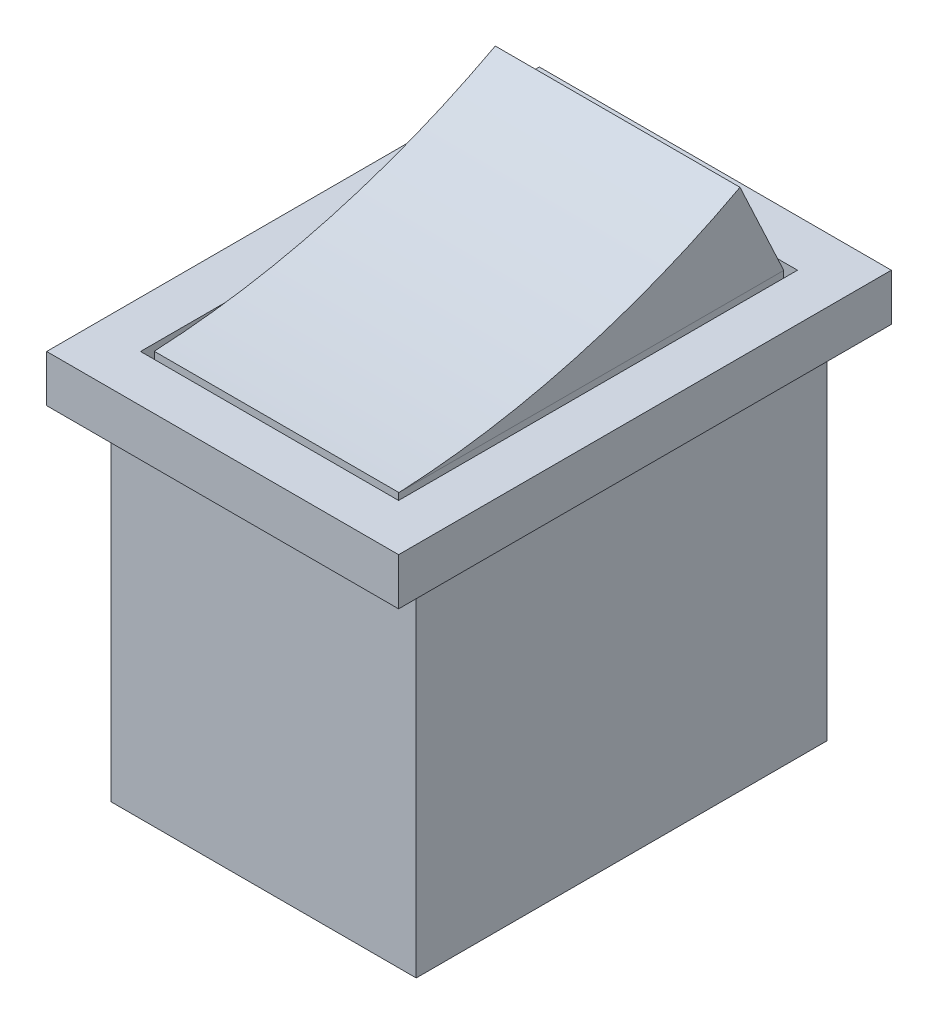
ISO-10303-21;
HEADER;
FILE_DESCRIPTION(('STEP AP214'),'2;1');
FILE_NAME('part.step','',(''),(''),'','','');
FILE_SCHEMA(('AUTOMOTIVE_DESIGN { 1 0 10303 214 1 1 1 1 }'));
ENDSEC;
DATA;
#1=APPLICATION_CONTEXT('core data for automotive mechanical design processes');
#2=APPLICATION_PROTOCOL_DEFINITION('international standard','automotive_design',2000,#1);
#3=PRODUCT_CONTEXT('',#1,'mechanical');
#4=PRODUCT('Part','Part','',(#3));
#5=PRODUCT_RELATED_PRODUCT_CATEGORY('part','',(#4));
#6=PRODUCT_DEFINITION_FORMATION('','',#4);
#7=PRODUCT_DEFINITION_CONTEXT('part definition',#1,'design');
#8=PRODUCT_DEFINITION('design','',#6,#7);
#9=PRODUCT_DEFINITION_SHAPE('','',#8);
#10=(LENGTH_UNIT() NAMED_UNIT(*) SI_UNIT(.MILLI.,.METRE.));
#11=(NAMED_UNIT(*) PLANE_ANGLE_UNIT() SI_UNIT($,.RADIAN.));
#12=(NAMED_UNIT(*) SI_UNIT($,.STERADIAN.) SOLID_ANGLE_UNIT());
#13=UNCERTAINTY_MEASURE_WITH_UNIT(LENGTH_MEASURE(1.E-05),#10,'distance_accuracy_value','');
#14=(GEOMETRIC_REPRESENTATION_CONTEXT(3) GLOBAL_UNCERTAINTY_ASSIGNED_CONTEXT((#13)) GLOBAL_UNIT_ASSIGNED_CONTEXT((#10,
#11,#12)) REPRESENTATION_CONTEXT('',''));
#15=CARTESIAN_POINT('',(0.,0.,0.));
#16=DIRECTION('',(0.,0.,1.));
#17=DIRECTION('',(1.,0.,0.));
#18=AXIS2_PLACEMENT_3D('',#15,#16,#17);
#19=CARTESIAN_POINT('',(5.215,17.,8.2));
#20=DIRECTION('',(0.,1.,0.));
#21=DIRECTION('',(0.,0.,1.));
#22=AXIS2_PLACEMENT_3D('',#19,#20,#21);
#23=PLANE('',#22);
#24=DIRECTION('',(0.,0.,-1.));
#25=VECTOR('',#24,1.);
#26=CARTESIAN_POINT('',(-5.215,17.,8.2));
#27=LINE('',#26,#25);
#28=CARTESIAN_POINT('',(-5.215,17.,8.2));
#29=VERTEX_POINT('',#28);
#30=CARTESIAN_POINT('',(-5.215,17.,-8.2));
#31=VERTEX_POINT('',#30);
#32=EDGE_CURVE('E93',#29,#31,#27,.T.);
#33=ORIENTED_EDGE('',*,*,#32,.T.);
#34=DIRECTION('',(-1.,0.,0.));
#35=VECTOR('',#34,1.);
#36=CARTESIAN_POINT('',(5.215,17.,-8.2));
#37=LINE('',#36,#35);
#38=CARTESIAN_POINT('',(5.215,17.,-8.2));
#39=VERTEX_POINT('',#38);
#40=EDGE_CURVE('E12',#39,#31,#37,.T.);
#41=ORIENTED_EDGE('',*,*,#40,.F.);
#42=DIRECTION('',(0.,0.,-1.));
#43=VECTOR('',#42,1.);
#44=CARTESIAN_POINT('',(5.215,17.,8.2));
#45=LINE('',#44,#43);
#46=CARTESIAN_POINT('',(5.215,17.,8.2));
#47=VERTEX_POINT('',#46);
#48=EDGE_CURVE('E86',#47,#39,#45,.T.);
#49=ORIENTED_EDGE('',*,*,#48,.F.);
#50=DIRECTION('',(-1.,0.,0.));
#51=VECTOR('',#50,1.);
#52=CARTESIAN_POINT('',(5.215,17.,8.2));
#53=LINE('',#52,#51);
#54=EDGE_CURVE('E94',#47,#29,#53,.T.);
#55=ORIENTED_EDGE('',*,*,#54,.T.);
#56=EDGE_LOOP('',(#33,#41,#49,#55));
#57=FACE_BOUND('',#56,.T.);
#58=ADVANCED_FACE('F46',(#57),#23,.F.);
#59=CARTESIAN_POINT('',(5.215,17.,-8.2));
#60=DIRECTION('',(0.,-0.422618261740704,0.906307787036648));
#61=DIRECTION('',(0.,-0.906307787036648,-0.422618261740704));
#62=AXIS2_PLACEMENT_3D('',#59,#60,#61);
#63=PLANE('',#62);
#64=DIRECTION('',(0.,0.906307787036648,0.422618261740704));
#65=VECTOR('',#64,1.);
#66=CARTESIAN_POINT('',(-5.215,17.,-8.2));
#67=LINE('',#66,#65);
#68=CARTESIAN_POINT('',(-5.215,21.,-6.33476936737998));
#69=VERTEX_POINT('',#68);
#70=EDGE_CURVE('E74',#31,#69,#67,.T.);
#71=ORIENTED_EDGE('',*,*,#70,.T.);
#72=DIRECTION('',(-1.,0.,0.));
#73=VECTOR('',#72,1.);
#74=CARTESIAN_POINT('',(5.215,21.,-6.33476936737998));
#75=LINE('',#74,#73);
#76=CARTESIAN_POINT('',(5.215,21.,-6.33476936737998));
#77=VERTEX_POINT('',#76);
#78=EDGE_CURVE('E54',#77,#69,#75,.T.);
#79=ORIENTED_EDGE('',*,*,#78,.F.);
#80=DIRECTION('',(0.,0.906307787036648,0.422618261740704));
#81=VECTOR('',#80,1.);
#82=CARTESIAN_POINT('',(5.215,17.,-8.2));
#83=LINE('',#82,#81);
#84=EDGE_CURVE('E82',#39,#77,#83,.T.);
#85=ORIENTED_EDGE('',*,*,#84,.F.);
#86=ORIENTED_EDGE('',*,*,#40,.T.);
#87=EDGE_LOOP('',(#71,#79,#85,#86));
#88=FACE_BOUND('',#87,.T.);
#89=ADVANCED_FACE('F83',(#88),#63,.F.);
#90=CARTESIAN_POINT('',(5.215,51.3836332347754,9.84466129825813));
#91=DIRECTION('',(-1.,0.,0.));
#92=DIRECTION('',(0.,0.,1.));
#93=AXIS2_PLACEMENT_3D('',#90,#91,#92);
#94=CYLINDRICAL_SURFACE('',#93,34.4229450397484);
#95=CARTESIAN_POINT('',(-5.215,51.3836332347754,9.84466129825813));
#96=DIRECTION('',(-1.,0.,0.));
#97=DIRECTION('',(0.,0.,1.));
#98=AXIS2_PLACEMENT_3D('',#95,#96,#97);
#99=CIRCLE('',#98,34.4229450397484);
#100=EDGE_CURVE('E79',#69,#29,#99,.T.);
#101=ORIENTED_EDGE('',*,*,#100,.T.);
#102=ORIENTED_EDGE('',*,*,#54,.F.);
#103=CARTESIAN_POINT('',(5.215,51.3836332347754,9.84466129825813));
#104=DIRECTION('',(-1.,0.,0.));
#105=DIRECTION('',(0.,0.,1.));
#106=AXIS2_PLACEMENT_3D('',#103,#104,#105);
#107=CIRCLE('',#106,34.4229450397484);
#108=EDGE_CURVE('E62',#77,#47,#107,.T.);
#109=ORIENTED_EDGE('',*,*,#108,.F.);
#110=ORIENTED_EDGE('',*,*,#78,.T.);
#111=EDGE_LOOP('',(#101,#102,#109,#110));
#112=FACE_BOUND('',#111,.T.);
#113=ADVANCED_FACE('F101',(#112),#94,.F.);
#114=CARTESIAN_POINT('',(5.215,51.3836332347754,9.84466129825813));
#115=DIRECTION('',(-1.,0.,0.));
#116=DIRECTION('',(0.,0.,1.));
#117=AXIS2_PLACEMENT_3D('',#114,#115,#116);
#118=PLANE('',#117);
#119=ORIENTED_EDGE('',*,*,#48,.T.);
#120=ORIENTED_EDGE('',*,*,#84,.T.);
#121=ORIENTED_EDGE('',*,*,#108,.T.);
#122=EDGE_LOOP('',(#119,#120,#121));
#123=FACE_BOUND('',#122,.T.);
#124=ADVANCED_FACE('F89',(#123),#118,.F.);
#125=CARTESIAN_POINT('',(-5.215,51.3836332347754,9.84466129825813));
#126=DIRECTION('',(-1.,0.,0.));
#127=DIRECTION('',(0.,0.,1.));
#128=AXIS2_PLACEMENT_3D('',#125,#126,#127);
#129=PLANE('',#128);
#130=ORIENTED_EDGE('',*,*,#32,.F.);
#131=ORIENTED_EDGE('',*,*,#100,.F.);
#132=ORIENTED_EDGE('',*,*,#70,.F.);
#133=EDGE_LOOP('',(#130,#131,#132));
#134=FACE_BOUND('',#133,.T.);
#135=ADVANCED_FACE('F102',(#134),#129,.T.);
#136=CLOSED_SHELL('',(#58,#89,#113,#124,#135));
#137=MANIFOLD_SOLID_BREP('B2',#136);
#138=CARTESIAN_POINT('',(6.5,15.,8.74999999999999));
#139=DIRECTION('',(-1.,0.,0.));
#140=DIRECTION('',(0.,0.,1.));
#141=AXIS2_PLACEMENT_3D('',#138,#139,#140);
#142=PLANE('',#141);
#143=DIRECTION('',(0.,0.,-1.));
#144=VECTOR('',#143,1.);
#145=CARTESIAN_POINT('',(6.5,0.,8.74999999999999));
#146=LINE('',#145,#144);
#147=CARTESIAN_POINT('',(6.5,0.,8.74999999999999));
#148=VERTEX_POINT('',#147);
#149=CARTESIAN_POINT('',(6.5,0.,-8.75000000000001));
#150=VERTEX_POINT('',#149);
#151=EDGE_CURVE('E366',#148,#150,#146,.T.);
#152=ORIENTED_EDGE('',*,*,#151,.T.);
#153=DIRECTION('',(0.,-1.,0.));
#154=VECTOR('',#153,1.);
#155=CARTESIAN_POINT('',(6.5,15.,-8.75000000000001));
#156=LINE('',#155,#154);
#157=CARTESIAN_POINT('',(6.5,15.,-8.75000000000001));
#158=VERTEX_POINT('',#157);
#159=EDGE_CURVE('E44',#158,#150,#156,.T.);
#160=ORIENTED_EDGE('',*,*,#159,.F.);
#161=DIRECTION('',(0.,0.,-1.));
#162=VECTOR('',#161,1.);
#163=CARTESIAN_POINT('',(6.5,15.,8.74999999999999));
#164=LINE('',#163,#162);
#165=CARTESIAN_POINT('',(6.5,15.,8.74999999999999));
#166=VERTEX_POINT('',#165);
#167=EDGE_CURVE('E367',#166,#158,#164,.T.);
#168=ORIENTED_EDGE('',*,*,#167,.F.);
#169=DIRECTION('',(0.,-1.,0.));
#170=VECTOR('',#169,1.);
#171=CARTESIAN_POINT('',(6.5,15.,8.74999999999999));
#172=LINE('',#171,#170);
#173=EDGE_CURVE('E380',#166,#148,#172,.T.);
#174=ORIENTED_EDGE('',*,*,#173,.T.);
#175=EDGE_LOOP('',(#152,#160,#168,#174));
#176=FACE_BOUND('',#175,.T.);
#177=ADVANCED_FACE('F153',(#176),#142,.F.);
#178=CARTESIAN_POINT('',(-6.5,15.,-8.75000000000001));
#179=DIRECTION('',(0.,0.,1.));
#180=DIRECTION('',(1.,0.,0.));
#181=AXIS2_PLACEMENT_3D('',#178,#179,#180);
#182=PLANE('',#181);
#183=DIRECTION('',(-1.,0.,0.));
#184=VECTOR('',#183,1.);
#185=CARTESIAN_POINT('',(-6.5,0.,-8.75000000000001));
#186=LINE('',#185,#184);
#187=CARTESIAN_POINT('',(-6.5,0.,-8.75000000000001));
#188=VERTEX_POINT('',#187);
#189=EDGE_CURVE('E383',#150,#188,#186,.T.);
#190=ORIENTED_EDGE('',*,*,#189,.T.);
#191=DIRECTION('',(0.,-1.,0.));
#192=VECTOR('',#191,1.);
#193=CARTESIAN_POINT('',(-6.5,15.,-8.75000000000001));
#194=LINE('',#193,#192);
#195=CARTESIAN_POINT('',(-6.5,15.,-8.75000000000001));
#196=VERTEX_POINT('',#195);
#197=EDGE_CURVE('E160',#196,#188,#194,.T.);
#198=ORIENTED_EDGE('',*,*,#197,.F.);
#199=DIRECTION('',(-1.,0.,0.));
#200=VECTOR('',#199,1.);
#201=CARTESIAN_POINT('',(-6.5,15.,-8.75000000000001));
#202=LINE('',#201,#200);
#203=EDGE_CURVE('E370',#158,#196,#202,.T.);
#204=ORIENTED_EDGE('',*,*,#203,.F.);
#205=ORIENTED_EDGE('',*,*,#159,.T.);
#206=EDGE_LOOP('',(#190,#198,#204,#205));
#207=FACE_BOUND('',#206,.T.);
#208=ADVANCED_FACE('F410',(#207),#182,.F.);
#209=CARTESIAN_POINT('',(-6.5,15.,8.74999999999999));
#210=DIRECTION('',(1.,0.,0.));
#211=DIRECTION('',(0.,0.,-1.));
#212=AXIS2_PLACEMENT_3D('',#209,#210,#211);
#213=PLANE('',#212);
#214=DIRECTION('',(0.,0.,1.));
#215=VECTOR('',#214,1.);
#216=CARTESIAN_POINT('',(-6.5,0.,8.74999999999999));
#217=LINE('',#216,#215);
#218=CARTESIAN_POINT('',(-6.5,0.,8.74999999999999));
#219=VERTEX_POINT('',#218);
#220=EDGE_CURVE('E385',#188,#219,#217,.T.);
#221=ORIENTED_EDGE('',*,*,#220,.T.);
#222=DIRECTION('',(0.,-1.,0.));
#223=VECTOR('',#222,1.);
#224=CARTESIAN_POINT('',(-6.5,15.,8.74999999999999));
#225=LINE('',#224,#223);
#226=CARTESIAN_POINT('',(-6.5,15.,8.74999999999999));
#227=VERTEX_POINT('',#226);
#228=EDGE_CURVE('E390',#227,#219,#225,.T.);
#229=ORIENTED_EDGE('',*,*,#228,.F.);
#230=DIRECTION('',(0.,0.,1.));
#231=VECTOR('',#230,1.);
#232=CARTESIAN_POINT('',(-6.5,15.,8.74999999999999));
#233=LINE('',#232,#231);
#234=EDGE_CURVE('E374',#196,#227,#233,.T.);
#235=ORIENTED_EDGE('',*,*,#234,.F.);
#236=ORIENTED_EDGE('',*,*,#197,.T.);
#237=EDGE_LOOP('',(#221,#229,#235,#236));
#238=FACE_BOUND('',#237,.T.);
#239=ADVANCED_FACE('F396',(#238),#213,.F.);
#240=CARTESIAN_POINT('',(-6.5,15.,8.74999999999999));
#241=DIRECTION('',(0.,0.,-1.));
#242=DIRECTION('',(-1.,0.,0.));
#243=AXIS2_PLACEMENT_3D('',#240,#241,#242);
#244=PLANE('',#243);
#245=DIRECTION('',(1.,0.,0.));
#246=VECTOR('',#245,1.);
#247=CARTESIAN_POINT('',(-6.5,0.,8.74999999999999));
#248=LINE('',#247,#246);
#249=EDGE_CURVE('E371',#219,#148,#248,.T.);
#250=ORIENTED_EDGE('',*,*,#249,.T.);
#251=ORIENTED_EDGE('',*,*,#173,.F.);
#252=DIRECTION('',(1.,0.,0.));
#253=VECTOR('',#252,1.);
#254=CARTESIAN_POINT('',(-6.5,15.,8.74999999999999));
#255=LINE('',#254,#253);
#256=EDGE_CURVE('E377',#227,#166,#255,.T.);
#257=ORIENTED_EDGE('',*,*,#256,.F.);
#258=ORIENTED_EDGE('',*,*,#228,.T.);
#259=EDGE_LOOP('',(#250,#251,#257,#258));
#260=FACE_BOUND('',#259,.T.);
#261=ADVANCED_FACE('F404',(#260),#244,.F.);
#262=CARTESIAN_POINT('',(0.,0.,0.));
#263=DIRECTION('',(0.,-1.,0.));
#264=DIRECTION('',(0.,0.,-1.));
#265=AXIS2_PLACEMENT_3D('',#262,#263,#264);
#266=PLANE('',#265);
#267=ORIENTED_EDGE('',*,*,#151,.F.);
#268=ORIENTED_EDGE('',*,*,#249,.F.);
#269=ORIENTED_EDGE('',*,*,#220,.F.);
#270=ORIENTED_EDGE('',*,*,#189,.F.);
#271=EDGE_LOOP('',(#267,#268,#269,#270));
#272=FACE_BOUND('',#271,.T.);
#273=ADVANCED_FACE('F401',(#272),#266,.T.);
#274=CARTESIAN_POINT('',(0.,15.,0.));
#275=DIRECTION('',(0.,-1.,0.));
#276=DIRECTION('',(0.,0.,-1.));
#277=AXIS2_PLACEMENT_3D('',#274,#275,#276);
#278=PLANE('',#277);
#279=DIRECTION('',(0.,0.,-1.));
#280=VECTOR('',#279,1.);
#281=CARTESIAN_POINT('',(7.5,15.,10.5));
#282=LINE('',#281,#280);
#283=CARTESIAN_POINT('',(7.5,15.,10.5));
#284=VERTEX_POINT('',#283);
#285=CARTESIAN_POINT('',(7.5,15.,-10.5));
#286=VERTEX_POINT('',#285);
#287=EDGE_CURVE('E331',#284,#286,#282,.T.);
#288=ORIENTED_EDGE('',*,*,#287,.F.);
#289=DIRECTION('',(1.,0.,0.));
#290=VECTOR('',#289,1.);
#291=CARTESIAN_POINT('',(-7.5,15.,10.5));
#292=LINE('',#291,#290);
#293=CARTESIAN_POINT('',(-7.5,15.,10.5));
#294=VERTEX_POINT('',#293);
#295=EDGE_CURVE('E341',#294,#284,#292,.T.);
#296=ORIENTED_EDGE('',*,*,#295,.F.);
#297=DIRECTION('',(0.,0.,1.));
#298=VECTOR('',#297,1.);
#299=CARTESIAN_POINT('',(-7.5,15.,10.5));
#300=LINE('',#299,#298);
#301=CARTESIAN_POINT('',(-7.5,15.,-10.5));
#302=VERTEX_POINT('',#301);
#303=EDGE_CURVE('E352',#302,#294,#300,.T.);
#304=ORIENTED_EDGE('',*,*,#303,.F.);
#305=DIRECTION('',(-1.,0.,0.));
#306=VECTOR('',#305,1.);
#307=CARTESIAN_POINT('',(-7.5,15.,-10.5));
#308=LINE('',#307,#306);
#309=EDGE_CURVE('E350',#286,#302,#308,.T.);
#310=ORIENTED_EDGE('',*,*,#309,.F.);
#311=EDGE_LOOP('',(#288,#296,#304,#310));
#312=FACE_BOUND('',#311,.T.);
#313=ORIENTED_EDGE('',*,*,#167,.T.);
#314=ORIENTED_EDGE('',*,*,#203,.T.);
#315=ORIENTED_EDGE('',*,*,#234,.T.);
#316=ORIENTED_EDGE('',*,*,#256,.T.);
#317=EDGE_LOOP('',(#313,#314,#315,#316));
#318=FACE_BOUND('',#317,.T.);
#319=ADVANCED_FACE('F409',(#312,#318),#278,.T.);
#320=CARTESIAN_POINT('',(7.5,17.,10.5));
#321=DIRECTION('',(-1.,0.,0.));
#322=DIRECTION('',(0.,0.,1.));
#323=AXIS2_PLACEMENT_3D('',#320,#321,#322);
#324=PLANE('',#323);
#325=ORIENTED_EDGE('',*,*,#287,.T.);
#326=DIRECTION('',(0.,-1.,0.));
#327=VECTOR('',#326,1.);
#328=CARTESIAN_POINT('',(7.5,17.,-10.5));
#329=LINE('',#328,#327);
#330=CARTESIAN_POINT('',(7.5,17.,-10.5));
#331=VERTEX_POINT('',#330);
#332=EDGE_CURVE('E363',#331,#286,#329,.T.);
#333=ORIENTED_EDGE('',*,*,#332,.F.);
#334=DIRECTION('',(0.,0.,-1.));
#335=VECTOR('',#334,1.);
#336=CARTESIAN_POINT('',(7.5,17.,10.5));
#337=LINE('',#336,#335);
#338=CARTESIAN_POINT('',(7.5,17.,10.5));
#339=VERTEX_POINT('',#338);
#340=EDGE_CURVE('E337',#339,#331,#337,.T.);
#341=ORIENTED_EDGE('',*,*,#340,.F.);
#342=DIRECTION('',(0.,-1.,0.));
#343=VECTOR('',#342,1.);
#344=CARTESIAN_POINT('',(7.5,17.,10.5));
#345=LINE('',#344,#343);
#346=EDGE_CURVE('E347',#339,#284,#345,.T.);
#347=ORIENTED_EDGE('',*,*,#346,.T.);
#348=EDGE_LOOP('',(#325,#333,#341,#347));
#349=FACE_BOUND('',#348,.T.);
#350=ADVANCED_FACE('F422',(#349),#324,.F.);
#351=CARTESIAN_POINT('',(-7.5,17.,-10.5));
#352=DIRECTION('',(0.,0.,1.));
#353=DIRECTION('',(1.,0.,0.));
#354=AXIS2_PLACEMENT_3D('',#351,#352,#353);
#355=PLANE('',#354);
#356=ORIENTED_EDGE('',*,*,#309,.T.);
#357=DIRECTION('',(0.,-1.,0.));
#358=VECTOR('',#357,1.);
#359=CARTESIAN_POINT('',(-7.5,17.,-10.5));
#360=LINE('',#359,#358);
#361=CARTESIAN_POINT('',(-7.5,17.,-10.5));
#362=VERTEX_POINT('',#361);
#363=EDGE_CURVE('E360',#362,#302,#360,.T.);
#364=ORIENTED_EDGE('',*,*,#363,.F.);
#365=DIRECTION('',(-1.,0.,0.));
#366=VECTOR('',#365,1.);
#367=CARTESIAN_POINT('',(-7.5,17.,-10.5));
#368=LINE('',#367,#366);
#369=EDGE_CURVE('E340',#331,#362,#368,.T.);
#370=ORIENTED_EDGE('',*,*,#369,.F.);
#371=ORIENTED_EDGE('',*,*,#332,.T.);
#372=EDGE_LOOP('',(#356,#364,#370,#371));
#373=FACE_BOUND('',#372,.T.);
#374=ADVANCED_FACE('F425',(#373),#355,.F.);
#375=CARTESIAN_POINT('',(-7.5,17.,10.5));
#376=DIRECTION('',(1.,0.,0.));
#377=DIRECTION('',(0.,0.,-1.));
#378=AXIS2_PLACEMENT_3D('',#375,#376,#377);
#379=PLANE('',#378);
#380=ORIENTED_EDGE('',*,*,#303,.T.);
#381=DIRECTION('',(0.,-1.,0.));
#382=VECTOR('',#381,1.);
#383=CARTESIAN_POINT('',(-7.5,17.,10.5));
#384=LINE('',#383,#382);
#385=CARTESIAN_POINT('',(-7.5,17.,10.5));
#386=VERTEX_POINT('',#385);
#387=EDGE_CURVE('E357',#386,#294,#384,.T.);
#388=ORIENTED_EDGE('',*,*,#387,.F.);
#389=DIRECTION('',(0.,0.,1.));
#390=VECTOR('',#389,1.);
#391=CARTESIAN_POINT('',(-7.5,17.,10.5));
#392=LINE('',#391,#390);
#393=EDGE_CURVE('E343',#362,#386,#392,.T.);
#394=ORIENTED_EDGE('',*,*,#393,.F.);
#395=ORIENTED_EDGE('',*,*,#363,.T.);
#396=EDGE_LOOP('',(#380,#388,#394,#395));
#397=FACE_BOUND('',#396,.T.);
#398=ADVANCED_FACE('F429',(#397),#379,.F.);
#399=CARTESIAN_POINT('',(-7.5,17.,10.5));
#400=DIRECTION('',(0.,0.,-1.));
#401=DIRECTION('',(-1.,0.,0.));
#402=AXIS2_PLACEMENT_3D('',#399,#400,#401);
#403=PLANE('',#402);
#404=ORIENTED_EDGE('',*,*,#295,.T.);
#405=ORIENTED_EDGE('',*,*,#346,.F.);
#406=DIRECTION('',(1.,0.,0.));
#407=VECTOR('',#406,1.);
#408=CARTESIAN_POINT('',(-7.5,17.,10.5));
#409=LINE('',#408,#407);
#410=EDGE_CURVE('E345',#386,#339,#409,.T.);
#411=ORIENTED_EDGE('',*,*,#410,.F.);
#412=ORIENTED_EDGE('',*,*,#387,.T.);
#413=EDGE_LOOP('',(#404,#405,#411,#412));
#414=FACE_BOUND('',#413,.T.);
#415=ADVANCED_FACE('F433',(#414),#403,.F.);
#416=CARTESIAN_POINT('',(0.,17.,0.));
#417=DIRECTION('',(0.,-1.,0.));
#418=DIRECTION('',(0.,0.,-1.));
#419=AXIS2_PLACEMENT_3D('',#416,#417,#418);
#420=PLANE('',#419);
#421=DIRECTION('',(-1.,0.,0.));
#422=VECTOR('',#421,1.);
#423=CARTESIAN_POINT('',(5.5,17.,-8.5));
#424=LINE('',#423,#422);
#425=CARTESIAN_POINT('',(5.5,17.,-8.5));
#426=VERTEX_POINT('',#425);
#427=CARTESIAN_POINT('',(-5.5,17.,-8.5));
#428=VERTEX_POINT('',#427);
#429=EDGE_CURVE('E321',#426,#428,#424,.T.);
#430=ORIENTED_EDGE('',*,*,#429,.F.);
#431=DIRECTION('',(0.,0.,-1.));
#432=VECTOR('',#431,1.);
#433=CARTESIAN_POINT('',(5.5,17.,8.5));
#434=LINE('',#433,#432);
#435=CARTESIAN_POINT('',(5.5,17.,8.5));
#436=VERTEX_POINT('',#435);
#437=EDGE_CURVE('E167',#436,#426,#434,.T.);
#438=ORIENTED_EDGE('',*,*,#437,.F.);
#439=DIRECTION('',(1.,0.,0.));
#440=VECTOR('',#439,1.);
#441=CARTESIAN_POINT('',(-5.5,17.,8.5));
#442=LINE('',#441,#440);
#443=CARTESIAN_POINT('',(-5.5,17.,8.5));
#444=VERTEX_POINT('',#443);
#445=EDGE_CURVE('E310',#444,#436,#442,.T.);
#446=ORIENTED_EDGE('',*,*,#445,.F.);
#447=DIRECTION('',(0.,0.,1.));
#448=VECTOR('',#447,1.);
#449=CARTESIAN_POINT('',(-5.5,17.,-8.5));
#450=LINE('',#449,#448);
#451=EDGE_CURVE('E324',#428,#444,#450,.T.);
#452=ORIENTED_EDGE('',*,*,#451,.F.);
#453=EDGE_LOOP('',(#430,#438,#446,#452));
#454=FACE_BOUND('',#453,.T.);
#455=ORIENTED_EDGE('',*,*,#340,.T.);
#456=ORIENTED_EDGE('',*,*,#369,.T.);
#457=ORIENTED_EDGE('',*,*,#393,.T.);
#458=ORIENTED_EDGE('',*,*,#410,.T.);
#459=EDGE_LOOP('',(#455,#456,#457,#458));
#460=FACE_BOUND('',#459,.T.);
#461=ADVANCED_FACE('F437',(#454,#460),#420,.F.);
#462=CARTESIAN_POINT('',(5.5,14.,8.5));
#463=DIRECTION('',(1.,0.,0.));
#464=DIRECTION('',(0.,0.,-1.));
#465=AXIS2_PLACEMENT_3D('',#462,#463,#464);
#466=PLANE('',#465);
#467=ORIENTED_EDGE('',*,*,#437,.T.);
#468=DIRECTION('',(0.,1.,0.));
#469=VECTOR('',#468,1.);
#470=CARTESIAN_POINT('',(5.5,14.,-8.5));
#471=LINE('',#470,#469);
#472=CARTESIAN_POINT('',(5.5,14.,-8.5));
#473=VERTEX_POINT('',#472);
#474=EDGE_CURVE('E319',#473,#426,#471,.T.);
#475=ORIENTED_EDGE('',*,*,#474,.F.);
#476=DIRECTION('',(0.,0.,-1.));
#477=VECTOR('',#476,1.);
#478=CARTESIAN_POINT('',(5.5,14.,8.5));
#479=LINE('',#478,#477);
#480=CARTESIAN_POINT('',(5.5,14.,8.5));
#481=VERTEX_POINT('',#480);
#482=EDGE_CURVE('E306',#481,#473,#479,.T.);
#483=ORIENTED_EDGE('',*,*,#482,.F.);
#484=DIRECTION('',(0.,1.,0.));
#485=VECTOR('',#484,1.);
#486=CARTESIAN_POINT('',(5.5,14.,8.5));
#487=LINE('',#486,#485);
#488=EDGE_CURVE('E329',#481,#436,#487,.T.);
#489=ORIENTED_EDGE('',*,*,#488,.T.);
#490=EDGE_LOOP('',(#467,#475,#483,#489));
#491=FACE_BOUND('',#490,.T.);
#492=ADVANCED_FACE('F444',(#491),#466,.F.);
#493=CARTESIAN_POINT('',(-5.5,14.,8.5));
#494=DIRECTION('',(0.,0.,1.));
#495=DIRECTION('',(1.,0.,0.));
#496=AXIS2_PLACEMENT_3D('',#493,#494,#495);
#497=PLANE('',#496);
#498=ORIENTED_EDGE('',*,*,#445,.T.);
#499=ORIENTED_EDGE('',*,*,#488,.F.);
#500=DIRECTION('',(1.,0.,0.));
#501=VECTOR('',#500,1.);
#502=CARTESIAN_POINT('',(-5.5,14.,8.5));
#503=LINE('',#502,#501);
#504=CARTESIAN_POINT('',(-5.5,14.,8.5));
#505=VERTEX_POINT('',#504);
#506=EDGE_CURVE('E316',#505,#481,#503,.T.);
#507=ORIENTED_EDGE('',*,*,#506,.F.);
#508=DIRECTION('',(0.,1.,0.));
#509=VECTOR('',#508,1.);
#510=CARTESIAN_POINT('',(-5.5,14.,8.5));
#511=LINE('',#510,#509);
#512=EDGE_CURVE('E332',#505,#444,#511,.T.);
#513=ORIENTED_EDGE('',*,*,#512,.T.);
#514=EDGE_LOOP('',(#498,#499,#507,#513));
#515=FACE_BOUND('',#514,.T.);
#516=ADVANCED_FACE('F449',(#515),#497,.F.);
#517=CARTESIAN_POINT('',(-5.5,14.,-8.5));
#518=DIRECTION('',(-1.,0.,0.));
#519=DIRECTION('',(0.,0.,1.));
#520=AXIS2_PLACEMENT_3D('',#517,#518,#519);
#521=PLANE('',#520);
#522=ORIENTED_EDGE('',*,*,#451,.T.);
#523=ORIENTED_EDGE('',*,*,#512,.F.);
#524=DIRECTION('',(0.,0.,1.));
#525=VECTOR('',#524,1.);
#526=CARTESIAN_POINT('',(-5.5,14.,-8.5));
#527=LINE('',#526,#525);
#528=CARTESIAN_POINT('',(-5.5,14.,-8.5));
#529=VERTEX_POINT('',#528);
#530=EDGE_CURVE('E313',#529,#505,#527,.T.);
#531=ORIENTED_EDGE('',*,*,#530,.F.);
#532=DIRECTION('',(0.,1.,0.));
#533=VECTOR('',#532,1.);
#534=CARTESIAN_POINT('',(-5.5,14.,-8.5));
#535=LINE('',#534,#533);
#536=EDGE_CURVE('E334',#529,#428,#535,.T.);
#537=ORIENTED_EDGE('',*,*,#536,.T.);
#538=EDGE_LOOP('',(#522,#523,#531,#537));
#539=FACE_BOUND('',#538,.T.);
#540=ADVANCED_FACE('F453',(#539),#521,.F.);
#541=CARTESIAN_POINT('',(5.5,14.,-8.5));
#542=DIRECTION('',(0.,0.,-1.));
#543=DIRECTION('',(-1.,0.,0.));
#544=AXIS2_PLACEMENT_3D('',#541,#542,#543);
#545=PLANE('',#544);
#546=ORIENTED_EDGE('',*,*,#429,.T.);
#547=ORIENTED_EDGE('',*,*,#536,.F.);
#548=DIRECTION('',(-1.,0.,0.));
#549=VECTOR('',#548,1.);
#550=CARTESIAN_POINT('',(5.5,14.,-8.5));
#551=LINE('',#550,#549);
#552=EDGE_CURVE('E309',#473,#529,#551,.T.);
#553=ORIENTED_EDGE('',*,*,#552,.F.);
#554=ORIENTED_EDGE('',*,*,#474,.T.);
#555=EDGE_LOOP('',(#546,#547,#553,#554));
#556=FACE_BOUND('',#555,.T.);
#557=ADVANCED_FACE('F450',(#556),#545,.F.);
#558=CARTESIAN_POINT('',(0.,14.,0.));
#559=DIRECTION('',(0.,1.,0.));
#560=DIRECTION('',(0.,0.,1.));
#561=AXIS2_PLACEMENT_3D('',#558,#559,#560);
#562=PLANE('',#561);
#563=DIRECTION('',(0.,0.,-1.));
#564=VECTOR('',#563,1.);
#565=CARTESIAN_POINT('',(5.2,14.,8.2));
#566=LINE('',#565,#564);
#567=CARTESIAN_POINT('',(5.2,14.,8.2));
#568=VERTEX_POINT('',#567);
#569=CARTESIAN_POINT('',(5.2,14.,-8.2));
#570=VERTEX_POINT('',#569);
#571=EDGE_CURVE('E277',#568,#570,#566,.T.);
#572=ORIENTED_EDGE('',*,*,#571,.F.);
#573=DIRECTION('',(1.,0.,0.));
#574=VECTOR('',#573,1.);
#575=CARTESIAN_POINT('',(-5.2,14.,8.2));
#576=LINE('',#575,#574);
#577=CARTESIAN_POINT('',(-5.2,14.,8.2));
#578=VERTEX_POINT('',#577);
#579=EDGE_CURVE('E287',#578,#568,#576,.T.);
#580=ORIENTED_EDGE('',*,*,#579,.F.);
#581=DIRECTION('',(0.,0.,1.));
#582=VECTOR('',#581,1.);
#583=CARTESIAN_POINT('',(-5.2,14.,-8.2));
#584=LINE('',#583,#582);
#585=CARTESIAN_POINT('',(-5.2,14.,-8.2));
#586=VERTEX_POINT('',#585);
#587=EDGE_CURVE('E269',#586,#578,#584,.T.);
#588=ORIENTED_EDGE('',*,*,#587,.F.);
#589=DIRECTION('',(-1.,0.,0.));
#590=VECTOR('',#589,1.);
#591=CARTESIAN_POINT('',(5.2,14.,-8.2));
#592=LINE('',#591,#590);
#593=EDGE_CURVE('E284',#570,#586,#592,.T.);
#594=ORIENTED_EDGE('',*,*,#593,.F.);
#595=EDGE_LOOP('',(#572,#580,#588,#594));
#596=FACE_BOUND('',#595,.T.);
#597=ORIENTED_EDGE('',*,*,#482,.T.);
#598=ORIENTED_EDGE('',*,*,#552,.T.);
#599=ORIENTED_EDGE('',*,*,#530,.T.);
#600=ORIENTED_EDGE('',*,*,#506,.T.);
#601=EDGE_LOOP('',(#597,#598,#599,#600));
#602=FACE_BOUND('',#601,.T.);
#603=ADVANCED_FACE('F282',(#596,#602),#562,.T.);
#604=CARTESIAN_POINT('',(5.2,14.,-8.2));
#605=DIRECTION('',(0.,0.,-1.));
#606=DIRECTION('',(-1.,0.,0.));
#607=AXIS2_PLACEMENT_3D('',#604,#605,#606);
#608=PLANE('',#607);
#609=DIRECTION('',(-1.,0.,0.));
#610=VECTOR('',#609,1.);
#611=CARTESIAN_POINT('',(5.2,17.,-8.2));
#612=LINE('',#611,#610);
#613=CARTESIAN_POINT('',(5.2,17.,-8.2));
#614=VERTEX_POINT('',#613);
#615=CARTESIAN_POINT('',(-5.2,17.,-8.2));
#616=VERTEX_POINT('',#615);
#617=EDGE_CURVE('E298',#614,#616,#612,.T.);
#618=ORIENTED_EDGE('',*,*,#617,.F.);
#619=DIRECTION('',(0.,1.,0.));
#620=VECTOR('',#619,1.);
#621=CARTESIAN_POINT('',(5.2,14.,-8.2));
#622=LINE('',#621,#620);
#623=EDGE_CURVE('E290',#570,#614,#622,.T.);
#624=ORIENTED_EDGE('',*,*,#623,.F.);
#625=ORIENTED_EDGE('',*,*,#593,.T.);
#626=DIRECTION('',(0.,1.,0.));
#627=VECTOR('',#626,1.);
#628=CARTESIAN_POINT('',(-5.2,14.,-8.2));
#629=LINE('',#628,#627);
#630=EDGE_CURVE('E266',#586,#616,#629,.T.);
#631=ORIENTED_EDGE('',*,*,#630,.T.);
#632=EDGE_LOOP('',(#618,#624,#625,#631));
#633=FACE_BOUND('',#632,.T.);
#634=ADVANCED_FACE('F289',(#633),#608,.T.);
#635=CARTESIAN_POINT('',(5.2,14.,8.2));
#636=DIRECTION('',(1.,0.,0.));
#637=DIRECTION('',(0.,0.,-1.));
#638=AXIS2_PLACEMENT_3D('',#635,#636,#637);
#639=PLANE('',#638);
#640=DIRECTION('',(0.,0.,-1.));
#641=VECTOR('',#640,1.);
#642=CARTESIAN_POINT('',(5.2,17.,8.2));
#643=LINE('',#642,#641);
#644=CARTESIAN_POINT('',(5.2,17.,8.2));
#645=VERTEX_POINT('',#644);
#646=EDGE_CURVE('E291',#645,#614,#643,.T.);
#647=ORIENTED_EDGE('',*,*,#646,.F.);
#648=DIRECTION('',(0.,1.,0.));
#649=VECTOR('',#648,1.);
#650=CARTESIAN_POINT('',(5.2,14.,8.2));
#651=LINE('',#650,#649);
#652=EDGE_CURVE('E303',#568,#645,#651,.T.);
#653=ORIENTED_EDGE('',*,*,#652,.F.);
#654=ORIENTED_EDGE('',*,*,#571,.T.);
#655=ORIENTED_EDGE('',*,*,#623,.T.);
#656=EDGE_LOOP('',(#647,#653,#654,#655));
#657=FACE_BOUND('',#656,.T.);
#658=ADVANCED_FACE('F465',(#657),#639,.T.);
#659=CARTESIAN_POINT('',(-5.2,14.,8.2));
#660=DIRECTION('',(0.,0.,1.));
#661=DIRECTION('',(1.,0.,0.));
#662=AXIS2_PLACEMENT_3D('',#659,#660,#661);
#663=PLANE('',#662);
#664=DIRECTION('',(1.,0.,0.));
#665=VECTOR('',#664,1.);
#666=CARTESIAN_POINT('',(-5.2,17.,8.2));
#667=LINE('',#666,#665);
#668=CARTESIAN_POINT('',(-5.2,17.,8.2));
#669=VERTEX_POINT('',#668);
#670=EDGE_CURVE('E175',#669,#645,#667,.T.);
#671=ORIENTED_EDGE('',*,*,#670,.F.);
#672=DIRECTION('',(0.,1.,0.));
#673=VECTOR('',#672,1.);
#674=CARTESIAN_POINT('',(-5.2,14.,8.2));
#675=LINE('',#674,#673);
#676=EDGE_CURVE('E276',#578,#669,#675,.T.);
#677=ORIENTED_EDGE('',*,*,#676,.F.);
#678=ORIENTED_EDGE('',*,*,#579,.T.);
#679=ORIENTED_EDGE('',*,*,#652,.T.);
#680=EDGE_LOOP('',(#671,#677,#678,#679));
#681=FACE_BOUND('',#680,.T.);
#682=ADVANCED_FACE('F468',(#681),#663,.T.);
#683=CARTESIAN_POINT('',(-5.2,14.,-8.2));
#684=DIRECTION('',(-1.,0.,0.));
#685=DIRECTION('',(0.,0.,1.));
#686=AXIS2_PLACEMENT_3D('',#683,#684,#685);
#687=PLANE('',#686);
#688=DIRECTION('',(0.,0.,1.));
#689=VECTOR('',#688,1.);
#690=CARTESIAN_POINT('',(-5.2,17.,-8.2));
#691=LINE('',#690,#689);
#692=EDGE_CURVE('E271',#616,#669,#691,.T.);
#693=ORIENTED_EDGE('',*,*,#692,.F.);
#694=ORIENTED_EDGE('',*,*,#630,.F.);
#695=ORIENTED_EDGE('',*,*,#587,.T.);
#696=ORIENTED_EDGE('',*,*,#676,.T.);
#697=EDGE_LOOP('',(#693,#694,#695,#696));
#698=FACE_BOUND('',#697,.T.);
#699=ADVANCED_FACE('F268',(#698),#687,.T.);
#700=ORIENTED_EDGE('',*,*,#617,.T.);
#701=ORIENTED_EDGE('',*,*,#692,.T.);
#702=ORIENTED_EDGE('',*,*,#670,.T.);
#703=ORIENTED_EDGE('',*,*,#646,.T.);
#704=EDGE_LOOP('',(#700,#701,#702,#703));
#705=FACE_BOUND('',#704,.T.);
#706=ADVANCED_FACE('F446',(#705),#420,.F.);
#707=CLOSED_SHELL('',(#177,#208,#239,#261,#273,#319,#350,#374,#398,#415,#461,#492,#516,#540,
#557,#603,#634,#658,#682,#699,#706));
#708=MANIFOLD_SOLID_BREP('B6',#707);
#709=ADVANCED_BREP_SHAPE_REPRESENTATION('',(#18,#137,#708),#14);
#710=SHAPE_DEFINITION_REPRESENTATION(#9,#709);
ENDSEC;
END-ISO-10303-21;
